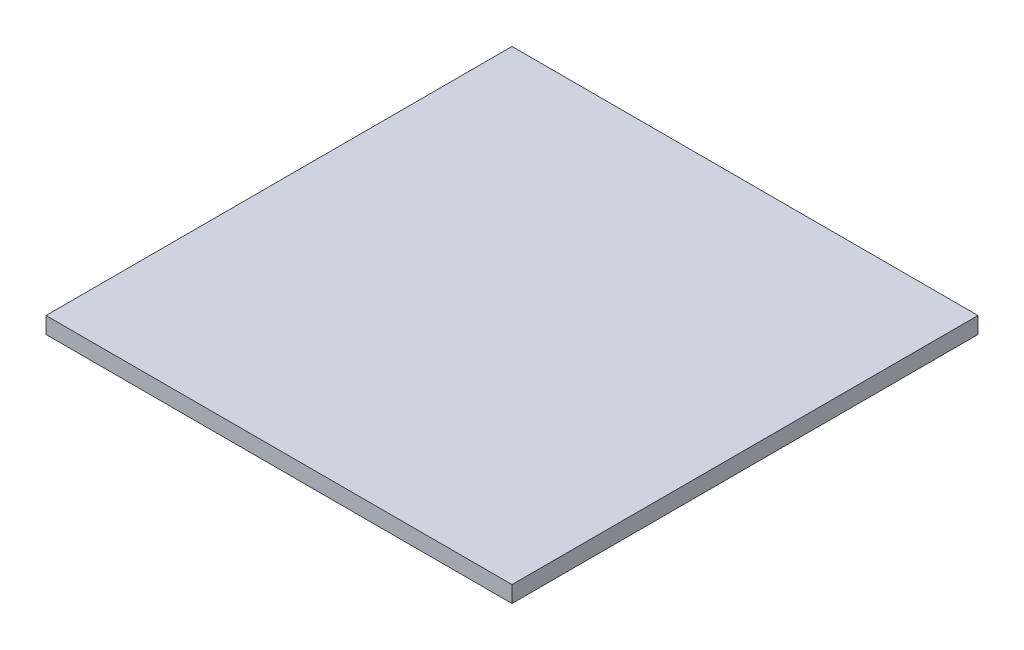
ISO-10303-21;
HEADER;
FILE_DESCRIPTION(('STEP AP214'),'2;1');
FILE_NAME('part.step','',(''),(''),'','','');
FILE_SCHEMA(('AUTOMOTIVE_DESIGN { 1 0 10303 214 1 1 1 1 }'));
ENDSEC;
DATA;
#1=APPLICATION_CONTEXT('core data for automotive mechanical design processes');
#2=APPLICATION_PROTOCOL_DEFINITION('international standard','automotive_design',2000,#1);
#3=PRODUCT_CONTEXT('',#1,'mechanical');
#4=PRODUCT('Part','Part','',(#3));
#5=PRODUCT_RELATED_PRODUCT_CATEGORY('part','',(#4));
#6=PRODUCT_DEFINITION_FORMATION('','',#4);
#7=PRODUCT_DEFINITION_CONTEXT('part definition',#1,'design');
#8=PRODUCT_DEFINITION('design','',#6,#7);
#9=PRODUCT_DEFINITION_SHAPE('','',#8);
#10=(LENGTH_UNIT() NAMED_UNIT(*) SI_UNIT(.MILLI.,.METRE.));
#11=(NAMED_UNIT(*) PLANE_ANGLE_UNIT() SI_UNIT($,.RADIAN.));
#12=(NAMED_UNIT(*) SI_UNIT($,.STERADIAN.) SOLID_ANGLE_UNIT());
#13=UNCERTAINTY_MEASURE_WITH_UNIT(LENGTH_MEASURE(1.E-05),#10,'distance_accuracy_value','');
#14=(GEOMETRIC_REPRESENTATION_CONTEXT(3) GLOBAL_UNCERTAINTY_ASSIGNED_CONTEXT((#13)) GLOBAL_UNIT_ASSIGNED_CONTEXT((#10,
#11,#12)) REPRESENTATION_CONTEXT('',''));
#15=CARTESIAN_POINT('',(0.,0.,0.));
#16=DIRECTION('',(0.,0.,1.));
#17=DIRECTION('',(1.,0.,0.));
#18=AXIS2_PLACEMENT_3D('',#15,#16,#17);
#19=CARTESIAN_POINT('',(0.,5.99999999999999,0.));
#20=DIRECTION('',(1.,0.,0.));
#21=DIRECTION('',(0.,0.,-1.));
#22=AXIS2_PLACEMENT_3D('',#19,#20,#21);
#23=PLANE('',#22);
#24=DIRECTION('',(0.,0.,1.));
#25=VECTOR('',#24,1.);
#26=CARTESIAN_POINT('',(0.,0.,0.));
#27=LINE('',#26,#25);
#28=CARTESIAN_POINT('',(0.,0.,-170.));
#29=VERTEX_POINT('',#28);
#30=CARTESIAN_POINT('',(0.,0.,0.));
#31=VERTEX_POINT('',#30);
#32=EDGE_CURVE('E95',#29,#31,#27,.T.);
#33=ORIENTED_EDGE('',*,*,#32,.T.);
#34=DIRECTION('',(0.,-1.,0.));
#35=VECTOR('',#34,1.);
#36=CARTESIAN_POINT('',(0.,5.99999999999999,0.));
#37=LINE('',#36,#35);
#38=CARTESIAN_POINT('',(0.,5.99999999999999,0.));
#39=VERTEX_POINT('',#38);
#40=EDGE_CURVE('E11',#39,#31,#37,.T.);
#41=ORIENTED_EDGE('',*,*,#40,.F.);
#42=DIRECTION('',(0.,0.,1.));
#43=VECTOR('',#42,1.);
#44=CARTESIAN_POINT('',(0.,5.99999999999999,0.));
#45=LINE('',#44,#43);
#46=CARTESIAN_POINT('',(0.,5.99999999999999,-170.));
#47=VERTEX_POINT('',#46);
#48=EDGE_CURVE('E83',#47,#39,#45,.T.);
#49=ORIENTED_EDGE('',*,*,#48,.F.);
#50=DIRECTION('',(0.,-1.,0.));
#51=VECTOR('',#50,1.);
#52=CARTESIAN_POINT('',(0.,5.99999999999999,-170.));
#53=LINE('',#52,#51);
#54=EDGE_CURVE('E91',#47,#29,#53,.T.);
#55=ORIENTED_EDGE('',*,*,#54,.T.);
#56=EDGE_LOOP('',(#33,#41,#49,#55));
#57=FACE_BOUND('',#56,.T.);
#58=ADVANCED_FACE('F32',(#57),#23,.F.);
#59=CARTESIAN_POINT('',(0.,5.99999999999999,0.));
#60=DIRECTION('',(0.,0.,-1.));
#61=DIRECTION('',(-1.,0.,0.));
#62=AXIS2_PLACEMENT_3D('',#59,#60,#61);
#63=PLANE('',#62);
#64=DIRECTION('',(1.,0.,0.));
#65=VECTOR('',#64,1.);
#66=CARTESIAN_POINT('',(0.,0.,0.));
#67=LINE('',#66,#65);
#68=CARTESIAN_POINT('',(170.,0.,0.));
#69=VERTEX_POINT('',#68);
#70=EDGE_CURVE('E87',#31,#69,#67,.T.);
#71=ORIENTED_EDGE('',*,*,#70,.T.);
#72=DIRECTION('',(0.,-1.,0.));
#73=VECTOR('',#72,1.);
#74=CARTESIAN_POINT('',(170.,5.99999999999999,0.));
#75=LINE('',#74,#73);
#76=CARTESIAN_POINT('',(170.,5.99999999999999,0.));
#77=VERTEX_POINT('',#76);
#78=EDGE_CURVE('E40',#77,#69,#75,.T.);
#79=ORIENTED_EDGE('',*,*,#78,.F.);
#80=DIRECTION('',(1.,0.,0.));
#81=VECTOR('',#80,1.);
#82=CARTESIAN_POINT('',(0.,5.99999999999999,0.));
#83=LINE('',#82,#81);
#84=EDGE_CURVE('E78',#39,#77,#83,.T.);
#85=ORIENTED_EDGE('',*,*,#84,.F.);
#86=ORIENTED_EDGE('',*,*,#40,.T.);
#87=EDGE_LOOP('',(#71,#79,#85,#86));
#88=FACE_BOUND('',#87,.T.);
#89=ADVANCED_FACE('F86',(#88),#63,.F.);
#90=CARTESIAN_POINT('',(170.,5.99999999999999,0.));
#91=DIRECTION('',(-1.,0.,0.));
#92=DIRECTION('',(0.,0.,1.));
#93=AXIS2_PLACEMENT_3D('',#90,#91,#92);
#94=PLANE('',#93);
#95=DIRECTION('',(0.,0.,-1.));
#96=VECTOR('',#95,1.);
#97=CARTESIAN_POINT('',(170.,0.,0.));
#98=LINE('',#97,#96);
#99=CARTESIAN_POINT('',(170.,0.,-170.));
#100=VERTEX_POINT('',#99);
#101=EDGE_CURVE('E65',#69,#100,#98,.T.);
#102=ORIENTED_EDGE('',*,*,#101,.T.);
#103=DIRECTION('',(0.,-1.,0.));
#104=VECTOR('',#103,1.);
#105=CARTESIAN_POINT('',(170.,5.99999999999999,-170.));
#106=LINE('',#105,#104);
#107=CARTESIAN_POINT('',(170.,5.99999999999999,-170.));
#108=VERTEX_POINT('',#107);
#109=EDGE_CURVE('E88',#108,#100,#106,.T.);
#110=ORIENTED_EDGE('',*,*,#109,.F.);
#111=DIRECTION('',(0.,0.,-1.));
#112=VECTOR('',#111,1.);
#113=CARTESIAN_POINT('',(170.,5.99999999999999,0.));
#114=LINE('',#113,#112);
#115=EDGE_CURVE('E81',#77,#108,#114,.T.);
#116=ORIENTED_EDGE('',*,*,#115,.F.);
#117=ORIENTED_EDGE('',*,*,#78,.T.);
#118=EDGE_LOOP('',(#102,#110,#116,#117));
#119=FACE_BOUND('',#118,.T.);
#120=ADVANCED_FACE('F89',(#119),#94,.F.);
#121=CARTESIAN_POINT('',(0.,5.99999999999999,-170.));
#122=DIRECTION('',(0.,0.,1.));
#123=DIRECTION('',(1.,0.,0.));
#124=AXIS2_PLACEMENT_3D('',#121,#122,#123);
#125=PLANE('',#124);
#126=DIRECTION('',(-1.,0.,0.));
#127=VECTOR('',#126,1.);
#128=CARTESIAN_POINT('',(0.,0.,-170.));
#129=LINE('',#128,#127);
#130=EDGE_CURVE('E71',#100,#29,#129,.T.);
#131=ORIENTED_EDGE('',*,*,#130,.T.);
#132=ORIENTED_EDGE('',*,*,#54,.F.);
#133=DIRECTION('',(-1.,0.,0.));
#134=VECTOR('',#133,1.);
#135=CARTESIAN_POINT('',(0.,5.99999999999999,-170.));
#136=LINE('',#135,#134);
#137=EDGE_CURVE('E48',#108,#47,#136,.T.);
#138=ORIENTED_EDGE('',*,*,#137,.F.);
#139=ORIENTED_EDGE('',*,*,#109,.T.);
#140=EDGE_LOOP('',(#131,#132,#138,#139));
#141=FACE_BOUND('',#140,.T.);
#142=ADVANCED_FACE('F102',(#141),#125,.F.);
#143=CARTESIAN_POINT('',(0.,5.99999999999999,0.));
#144=DIRECTION('',(0.,-1.,0.));
#145=DIRECTION('',(0.,0.,-1.));
#146=AXIS2_PLACEMENT_3D('',#143,#144,#145);
#147=PLANE('',#146);
#148=ORIENTED_EDGE('',*,*,#48,.T.);
#149=ORIENTED_EDGE('',*,*,#84,.T.);
#150=ORIENTED_EDGE('',*,*,#115,.T.);
#151=ORIENTED_EDGE('',*,*,#137,.T.);
#152=EDGE_LOOP('',(#148,#149,#150,#151));
#153=FACE_BOUND('',#152,.T.);
#154=ADVANCED_FACE('F79',(#153),#147,.F.);
#155=CARTESIAN_POINT('',(0.,0.,0.));
#156=DIRECTION('',(0.,-1.,0.));
#157=DIRECTION('',(0.,0.,-1.));
#158=AXIS2_PLACEMENT_3D('',#155,#156,#157);
#159=PLANE('',#158);
#160=ORIENTED_EDGE('',*,*,#32,.F.);
#161=ORIENTED_EDGE('',*,*,#130,.F.);
#162=ORIENTED_EDGE('',*,*,#101,.F.);
#163=ORIENTED_EDGE('',*,*,#70,.F.);
#164=EDGE_LOOP('',(#160,#161,#162,#163));
#165=FACE_BOUND('',#164,.T.);
#166=ADVANCED_FACE('F105',(#165),#159,.T.);
#167=CLOSED_SHELL('',(#58,#89,#120,#142,#154,#166));
#168=MANIFOLD_SOLID_BREP('B2',#167);
#169=ADVANCED_BREP_SHAPE_REPRESENTATION('',(#18,#168),#14);
#170=SHAPE_DEFINITION_REPRESENTATION(#9,#169);
ENDSEC;
END-ISO-10303-21;
